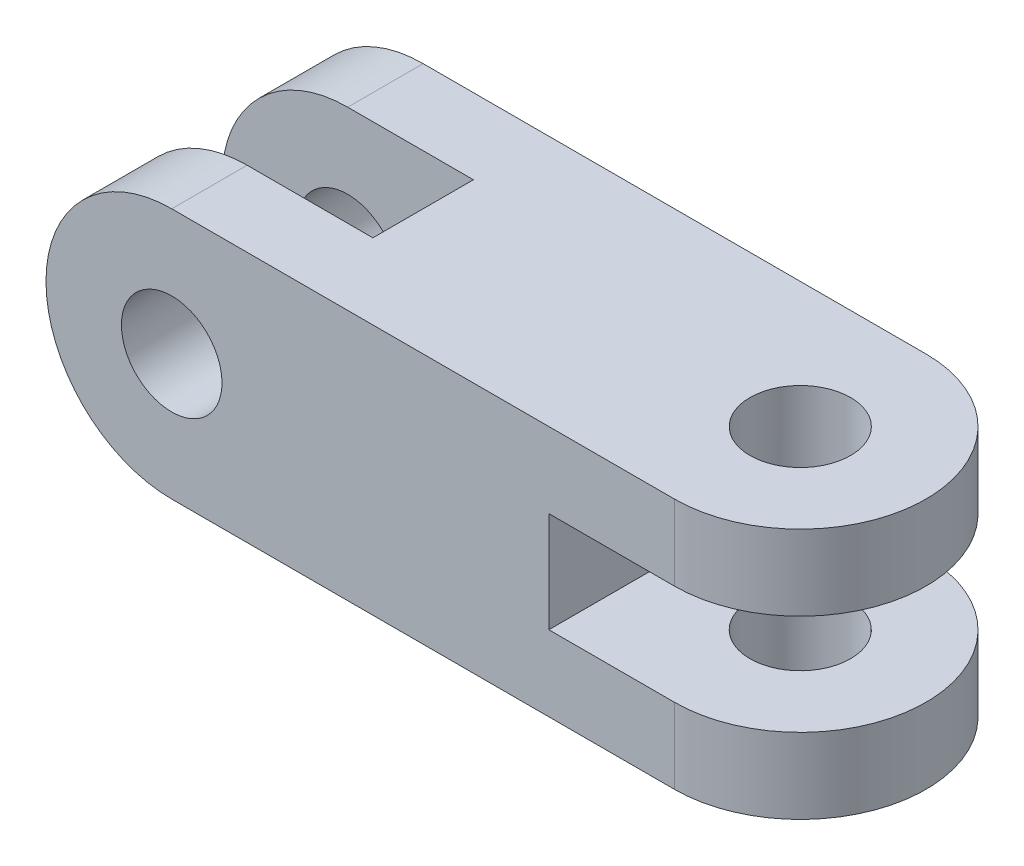
ISO-10303-21;
HEADER;
FILE_DESCRIPTION(('STEP AP214'),'2;1');
FILE_NAME('part.step','',(''),(''),'','','');
FILE_SCHEMA(('AUTOMOTIVE_DESIGN { 1 0 10303 214 1 1 1 1 }'));
ENDSEC;
DATA;
#1=APPLICATION_CONTEXT('core data for automotive mechanical design processes');
#2=APPLICATION_PROTOCOL_DEFINITION('international standard','automotive_design',2000,#1);
#3=PRODUCT_CONTEXT('',#1,'mechanical');
#4=PRODUCT('Part','Part','',(#3));
#5=PRODUCT_RELATED_PRODUCT_CATEGORY('part','',(#4));
#6=PRODUCT_DEFINITION_FORMATION('','',#4);
#7=PRODUCT_DEFINITION_CONTEXT('part definition',#1,'design');
#8=PRODUCT_DEFINITION('design','',#6,#7);
#9=PRODUCT_DEFINITION_SHAPE('','',#8);
#10=(LENGTH_UNIT() NAMED_UNIT(*) SI_UNIT(.MILLI.,.METRE.));
#11=(NAMED_UNIT(*) PLANE_ANGLE_UNIT() SI_UNIT($,.RADIAN.));
#12=(NAMED_UNIT(*) SI_UNIT($,.STERADIAN.) SOLID_ANGLE_UNIT());
#13=UNCERTAINTY_MEASURE_WITH_UNIT(LENGTH_MEASURE(1.E-05),#10,'distance_accuracy_value','');
#14=(GEOMETRIC_REPRESENTATION_CONTEXT(3) GLOBAL_UNCERTAINTY_ASSIGNED_CONTEXT((#13)) GLOBAL_UNIT_ASSIGNED_CONTEXT((#10,
#11,#12)) REPRESENTATION_CONTEXT('',''));
#15=CARTESIAN_POINT('',(0.,0.,0.));
#16=DIRECTION('',(0.,0.,1.));
#17=DIRECTION('',(1.,0.,0.));
#18=AXIS2_PLACEMENT_3D('',#15,#16,#17);
#19=CARTESIAN_POINT('',(-53.5,25.,5.18840413904367));
#20=DIRECTION('',(0.,0.,-1.));
#21=DIRECTION('',(-1.,0.,0.));
#22=AXIS2_PLACEMENT_3D('',#19,#20,#21);
#23=CYLINDRICAL_SURFACE('',#22,25.);
#24=DIRECTION('',(0.,0.,1.));
#25=VECTOR('',#24,1.);
#26=CARTESIAN_POINT('',(-53.5,50.,5.18840413904367));
#27=LINE('',#26,#25);
#28=CARTESIAN_POINT('',(-53.5,50.,-19.8115958609563));
#29=VERTEX_POINT('',#28);
#30=CARTESIAN_POINT('',(-53.5,50.,-4.81159586095631));
#31=VERTEX_POINT('',#30);
#32=EDGE_CURVE('E254',#29,#31,#27,.T.);
#33=ORIENTED_EDGE('',*,*,#32,.F.);
#34=CARTESIAN_POINT('',(-53.5,25.,-19.8115958609563));
#35=DIRECTION('',(0.,0.,1.));
#36=DIRECTION('',(1.,0.,0.));
#37=AXIS2_PLACEMENT_3D('',#34,#35,#36);
#38=CIRCLE('',#37,25.);
#39=CARTESIAN_POINT('',(-78.5,25.,-19.8115958609563));
#40=VERTEX_POINT('',#39);
#41=EDGE_CURVE('E42',#40,#29,#38,.F.);
#42=ORIENTED_EDGE('',*,*,#41,.F.);
#43=DIRECTION('',(0.,0.,1.));
#44=VECTOR('',#43,1.);
#45=CARTESIAN_POINT('',(-78.5,25.,-19.8115958609563));
#46=LINE('',#45,#44);
#47=CARTESIAN_POINT('',(-78.5,25.,-4.81159586095631));
#48=VERTEX_POINT('',#47);
#49=EDGE_CURVE('E222',#40,#48,#46,.T.);
#50=ORIENTED_EDGE('',*,*,#49,.T.);
#51=CARTESIAN_POINT('',(-53.5,25.,-4.81159586095631));
#52=DIRECTION('',(0.,0.,-1.));
#53=DIRECTION('',(-1.,0.,0.));
#54=AXIS2_PLACEMENT_3D('',#51,#52,#53);
#55=CIRCLE('',#54,25.);
#56=EDGE_CURVE('E11',#31,#48,#55,.F.);
#57=ORIENTED_EDGE('',*,*,#56,.F.);
#58=EDGE_LOOP('',(#33,#42,#50,#57));
#59=FACE_BOUND('',#58,.T.);
#60=ADVANCED_FACE('F35',(#59),#23,.T.);
#61=CARTESIAN_POINT('',(-53.5,25.,5.18840413904349));
#62=DIRECTION('',(0.,0.,-1.));
#63=DIRECTION('',(-1.,0.,0.));
#64=AXIS2_PLACEMENT_3D('',#61,#62,#63);
#65=CYLINDRICAL_SURFACE('',#64,25.);
#66=DIRECTION('',(0.,0.,1.));
#67=VECTOR('',#66,1.);
#68=CARTESIAN_POINT('',(-53.5,50.,5.18840413904349));
#69=LINE('',#68,#67);
#70=CARTESIAN_POINT('',(-53.5,50.,15.1884041390437));
#71=VERTEX_POINT('',#70);
#72=CARTESIAN_POINT('',(-53.5,50.,30.1884041390437));
#73=VERTEX_POINT('',#72);
#74=EDGE_CURVE('E247',#71,#73,#69,.T.);
#75=ORIENTED_EDGE('',*,*,#74,.F.);
#76=CARTESIAN_POINT('',(-53.5,25.,15.1884041390437));
#77=DIRECTION('',(0.,0.,1.));
#78=DIRECTION('',(1.,0.,0.));
#79=AXIS2_PLACEMENT_3D('',#76,#77,#78);
#80=CIRCLE('',#79,25.);
#81=CARTESIAN_POINT('',(-78.5,25.,15.1884041390437));
#82=VERTEX_POINT('',#81);
#83=EDGE_CURVE('E250',#82,#71,#80,.F.);
#84=ORIENTED_EDGE('',*,*,#83,.F.);
#85=DIRECTION('',(0.,0.,1.));
#86=VECTOR('',#85,1.);
#87=CARTESIAN_POINT('',(-78.5,25.,15.1884041390437));
#88=LINE('',#87,#86);
#89=CARTESIAN_POINT('',(-78.5,25.,30.1884041390437));
#90=VERTEX_POINT('',#89);
#91=EDGE_CURVE('E236',#82,#90,#88,.T.);
#92=ORIENTED_EDGE('',*,*,#91,.T.);
#93=CARTESIAN_POINT('',(-53.5,25.,30.1884041390437));
#94=DIRECTION('',(0.,0.,-1.));
#95=DIRECTION('',(-1.,0.,0.));
#96=AXIS2_PLACEMENT_3D('',#93,#94,#95);
#97=CIRCLE('',#96,25.);
#98=EDGE_CURVE('E252',#73,#90,#97,.F.);
#99=ORIENTED_EDGE('',*,*,#98,.F.);
#100=EDGE_LOOP('',(#75,#84,#92,#99));
#101=FACE_BOUND('',#100,.T.);
#102=ADVANCED_FACE('F277',(#101),#65,.T.);
#103=CARTESIAN_POINT('',(-53.5,25.,15.1884041390437));
#104=DIRECTION('',(0.,0.,1.));
#105=DIRECTION('',(1.,0.,0.));
#106=AXIS2_PLACEMENT_3D('',#103,#104,#105);
#107=CYLINDRICAL_SURFACE('',#106,25.);
#108=ORIENTED_EDGE('',*,*,#91,.F.);
#109=CARTESIAN_POINT('',(-53.5,25.,15.1884041390437));
#110=DIRECTION('',(0.,0.,1.));
#111=DIRECTION('',(1.,0.,0.));
#112=AXIS2_PLACEMENT_3D('',#109,#110,#111);
#113=CIRCLE('',#112,25.);
#114=CARTESIAN_POINT('',(-53.5,0.,15.1884041390437));
#115=VERTEX_POINT('',#114);
#116=EDGE_CURVE('E242',#115,#82,#113,.F.);
#117=ORIENTED_EDGE('',*,*,#116,.F.);
#118=DIRECTION('',(0.,0.,1.));
#119=VECTOR('',#118,1.);
#120=CARTESIAN_POINT('',(-53.5,0.,5.18840413904349));
#121=LINE('',#120,#119);
#122=CARTESIAN_POINT('',(-53.5,0.,30.1884041390437));
#123=VERTEX_POINT('',#122);
#124=EDGE_CURVE('E239',#123,#115,#121,.F.);
#125=ORIENTED_EDGE('',*,*,#124,.F.);
#126=CARTESIAN_POINT('',(-53.5,25.,30.1884041390437));
#127=DIRECTION('',(0.,0.,-1.));
#128=DIRECTION('',(-1.,0.,0.));
#129=AXIS2_PLACEMENT_3D('',#126,#127,#128);
#130=CIRCLE('',#129,25.);
#131=EDGE_CURVE('E245',#90,#123,#130,.F.);
#132=ORIENTED_EDGE('',*,*,#131,.F.);
#133=EDGE_LOOP('',(#108,#117,#125,#132));
#134=FACE_BOUND('',#133,.T.);
#135=ADVANCED_FACE('F284',(#134),#107,.T.);
#136=CARTESIAN_POINT('',(-53.5,25.,-19.8115958609563));
#137=DIRECTION('',(0.,0.,1.));
#138=DIRECTION('',(1.,0.,0.));
#139=AXIS2_PLACEMENT_3D('',#136,#137,#138);
#140=CYLINDRICAL_SURFACE('',#139,25.);
#141=ORIENTED_EDGE('',*,*,#49,.F.);
#142=CARTESIAN_POINT('',(-53.5,25.,-19.8115958609563));
#143=DIRECTION('',(0.,0.,1.));
#144=DIRECTION('',(1.,0.,0.));
#145=AXIS2_PLACEMENT_3D('',#142,#143,#144);
#146=CIRCLE('',#145,25.);
#147=CARTESIAN_POINT('',(-53.5,0.,-19.8115958609563));
#148=VERTEX_POINT('',#147);
#149=EDGE_CURVE('E234',#148,#40,#146,.F.);
#150=ORIENTED_EDGE('',*,*,#149,.F.);
#151=DIRECTION('',(0.,0.,1.));
#152=VECTOR('',#151,1.);
#153=CARTESIAN_POINT('',(-53.5,0.,5.18840413904367));
#154=LINE('',#153,#152);
#155=CARTESIAN_POINT('',(-53.5,0.,-4.81159586095631));
#156=VERTEX_POINT('',#155);
#157=EDGE_CURVE('E231',#156,#148,#154,.F.);
#158=ORIENTED_EDGE('',*,*,#157,.F.);
#159=CARTESIAN_POINT('',(-53.5,25.,-4.81159586095631));
#160=DIRECTION('',(0.,0.,-1.));
#161=DIRECTION('',(-1.,0.,0.));
#162=AXIS2_PLACEMENT_3D('',#159,#160,#161);
#163=CIRCLE('',#162,25.);
#164=EDGE_CURVE('E228',#48,#156,#163,.F.);
#165=ORIENTED_EDGE('',*,*,#164,.F.);
#166=EDGE_LOOP('',(#141,#150,#158,#165));
#167=FACE_BOUND('',#166,.T.);
#168=ADVANCED_FACE('F314',(#167),#140,.T.);
#169=CARTESIAN_POINT('',(46.5,50.,5.18840413904367));
#170=DIRECTION('',(0.,-1.,0.));
#171=DIRECTION('',(0.,0.,-1.));
#172=AXIS2_PLACEMENT_3D('',#169,#170,#171);
#173=CYLINDRICAL_SURFACE('',#172,25.);
#174=CARTESIAN_POINT('',(46.5,15.,5.18840413904367));
#175=DIRECTION('',(0.,-1.,0.));
#176=DIRECTION('',(1.,0.,0.));
#177=AXIS2_PLACEMENT_3D('',#174,#175,#176);
#178=CIRCLE('',#177,25.);
#179=CARTESIAN_POINT('',(46.5,15.,-19.8115958609563));
#180=VERTEX_POINT('',#179);
#181=CARTESIAN_POINT('',(46.5,15.,30.1884041390437));
#182=VERTEX_POINT('',#181);
#183=EDGE_CURVE('E172',#180,#182,#178,.T.);
#184=ORIENTED_EDGE('',*,*,#183,.T.);
#185=DIRECTION('',(0.,-1.,0.));
#186=VECTOR('',#185,1.);
#187=CARTESIAN_POINT('',(46.5,50.,30.1884041390437));
#188=LINE('',#187,#186);
#189=CARTESIAN_POINT('',(46.5,0.,30.1884041390437));
#190=VERTEX_POINT('',#189);
#191=EDGE_CURVE('E197',#182,#190,#188,.T.);
#192=ORIENTED_EDGE('',*,*,#191,.T.);
#193=CARTESIAN_POINT('',(46.5,0.,5.18840413904367));
#194=DIRECTION('',(0.,1.,0.));
#195=DIRECTION('',(0.,0.,1.));
#196=AXIS2_PLACEMENT_3D('',#193,#194,#195);
#197=CIRCLE('',#196,25.);
#198=CARTESIAN_POINT('',(46.5,0.,-19.8115958609563));
#199=VERTEX_POINT('',#198);
#200=EDGE_CURVE('E178',#190,#199,#197,.T.);
#201=ORIENTED_EDGE('',*,*,#200,.T.);
#202=DIRECTION('',(0.,-1.,0.));
#203=VECTOR('',#202,1.);
#204=CARTESIAN_POINT('',(46.5,50.,-19.8115958609563));
#205=LINE('',#204,#203);
#206=EDGE_CURVE('E220',#180,#199,#205,.T.);
#207=ORIENTED_EDGE('',*,*,#206,.F.);
#208=EDGE_LOOP('',(#184,#192,#201,#207));
#209=FACE_BOUND('',#208,.T.);
#210=ADVANCED_FACE('F295',(#209),#173,.T.);
#211=CARTESIAN_POINT('',(46.5,50.,5.18840413904367));
#212=DIRECTION('',(0.,-1.,0.));
#213=DIRECTION('',(0.,0.,-1.));
#214=AXIS2_PLACEMENT_3D('',#211,#212,#213);
#215=CYLINDRICAL_SURFACE('',#214,10.);
#216=CARTESIAN_POINT('',(46.5,15.,5.18840413904367));
#217=DIRECTION('',(0.,-1.,0.));
#218=DIRECTION('',(1.,0.,0.));
#219=AXIS2_PLACEMENT_3D('',#216,#217,#218);
#220=CIRCLE('',#219,10.);
#221=CARTESIAN_POINT('',(56.5,15.,5.18840413904367));
#222=VERTEX_POINT('',#221);
#223=EDGE_CURVE('E171',#222,#222,#220,.T.);
#224=ORIENTED_EDGE('',*,*,#223,.F.);
#225=EDGE_LOOP('',(#224));
#226=FACE_BOUND('',#225,.T.);
#227=CARTESIAN_POINT('',(46.5,0.,5.18840413904367));
#228=DIRECTION('',(0.,1.,0.));
#229=DIRECTION('',(0.,0.,1.));
#230=AXIS2_PLACEMENT_3D('',#227,#228,#229);
#231=CIRCLE('',#230,10.);
#232=CARTESIAN_POINT('',(46.5,0.,15.1884041390437));
#233=VERTEX_POINT('',#232);
#234=EDGE_CURVE('E174',#233,#233,#231,.T.);
#235=ORIENTED_EDGE('',*,*,#234,.F.);
#236=EDGE_LOOP('',(#235));
#237=FACE_BOUND('',#236,.T.);
#238=ADVANCED_FACE('F313',(#226,#237),#215,.F.);
#239=CARTESIAN_POINT('',(46.5,50.,5.18840413904367));
#240=DIRECTION('',(0.,1.,0.));
#241=DIRECTION('',(0.,0.,1.));
#242=AXIS2_PLACEMENT_3D('',#239,#240,#241);
#243=PLANE('',#242);
#244=DIRECTION('',(-1.,0.,0.));
#245=VECTOR('',#244,1.);
#246=CARTESIAN_POINT('',(46.5,50.,-19.8115958609563));
#247=LINE('',#246,#245);
#248=CARTESIAN_POINT('',(46.5,50.,-19.8115958609563));
#249=VERTEX_POINT('',#248);
#250=EDGE_CURVE('E184',#249,#29,#247,.T.);
#251=ORIENTED_EDGE('',*,*,#250,.T.);
#252=ORIENTED_EDGE('',*,*,#32,.T.);
#253=DIRECTION('',(1.,0.,0.));
#254=VECTOR('',#253,1.);
#255=CARTESIAN_POINT('',(-78.5,50.,-4.81159586095631));
#256=LINE('',#255,#254);
#257=CARTESIAN_POINT('',(-28.5,50.,-4.81159586095631));
#258=VERTEX_POINT('',#257);
#259=EDGE_CURVE('E188',#31,#258,#256,.T.);
#260=ORIENTED_EDGE('',*,*,#259,.T.);
#261=DIRECTION('',(0.,0.,1.));
#262=VECTOR('',#261,1.);
#263=CARTESIAN_POINT('',(-28.5,50.,-4.81159586095631));
#264=LINE('',#263,#262);
#265=CARTESIAN_POINT('',(-28.5,50.,15.1884041390437));
#266=VERTEX_POINT('',#265);
#267=EDGE_CURVE('E190',#258,#266,#264,.T.);
#268=ORIENTED_EDGE('',*,*,#267,.T.);
#269=DIRECTION('',(-1.,0.,0.));
#270=VECTOR('',#269,1.);
#271=CARTESIAN_POINT('',(-78.5,50.,15.1884041390437));
#272=LINE('',#271,#270);
#273=EDGE_CURVE('E192',#266,#71,#272,.T.);
#274=ORIENTED_EDGE('',*,*,#273,.T.);
#275=ORIENTED_EDGE('',*,*,#74,.T.);
#276=DIRECTION('',(1.,0.,0.));
#277=VECTOR('',#276,1.);
#278=CARTESIAN_POINT('',(46.5,50.,30.1884041390437));
#279=LINE('',#278,#277);
#280=CARTESIAN_POINT('',(46.5,50.,30.1884041390437));
#281=VERTEX_POINT('',#280);
#282=EDGE_CURVE('E195',#73,#281,#279,.T.);
#283=ORIENTED_EDGE('',*,*,#282,.T.);
#284=CARTESIAN_POINT('',(46.5,50.,5.18840413904367));
#285=DIRECTION('',(0.,1.,0.));
#286=DIRECTION('',(0.,0.,1.));
#287=AXIS2_PLACEMENT_3D('',#284,#285,#286);
#288=CIRCLE('',#287,25.);
#289=EDGE_CURVE('E181',#281,#249,#288,.T.);
#290=ORIENTED_EDGE('',*,*,#289,.T.);
#291=EDGE_LOOP('',(#251,#252,#260,#268,#274,#275,#283,#290));
#292=FACE_BOUND('',#291,.T.);
#293=CARTESIAN_POINT('',(46.5,50.,5.18840413904367));
#294=DIRECTION('',(0.,1.,0.));
#295=DIRECTION('',(0.,0.,1.));
#296=AXIS2_PLACEMENT_3D('',#293,#294,#295);
#297=CIRCLE('',#296,10.);
#298=CARTESIAN_POINT('',(46.5,50.,15.1884041390437));
#299=VERTEX_POINT('',#298);
#300=EDGE_CURVE('E175',#299,#299,#297,.T.);
#301=ORIENTED_EDGE('',*,*,#300,.F.);
#302=EDGE_LOOP('',(#301));
#303=FACE_BOUND('',#302,.T.);
#304=ADVANCED_FACE('F257',(#292,#303),#243,.T.);
#305=CARTESIAN_POINT('',(46.5,0.,5.18840413904367));
#306=DIRECTION('',(0.,1.,0.));
#307=DIRECTION('',(0.,0.,1.));
#308=AXIS2_PLACEMENT_3D('',#305,#306,#307);
#309=PLANE('',#308);
#310=DIRECTION('',(1.,0.,0.));
#311=VECTOR('',#310,1.);
#312=CARTESIAN_POINT('',(46.5,0.,30.1884041390437));
#313=LINE('',#312,#311);
#314=EDGE_CURVE('E185',#123,#190,#313,.T.);
#315=ORIENTED_EDGE('',*,*,#314,.F.);
#316=ORIENTED_EDGE('',*,*,#124,.T.);
#317=DIRECTION('',(-1.,0.,0.));
#318=VECTOR('',#317,1.);
#319=CARTESIAN_POINT('',(-78.5,0.,15.1884041390437));
#320=LINE('',#319,#318);
#321=CARTESIAN_POINT('',(-28.5,0.,15.1884041390437));
#322=VERTEX_POINT('',#321);
#323=EDGE_CURVE('E207',#322,#115,#320,.T.);
#324=ORIENTED_EDGE('',*,*,#323,.F.);
#325=DIRECTION('',(0.,0.,1.));
#326=VECTOR('',#325,1.);
#327=CARTESIAN_POINT('',(-28.5,0.,-4.81159586095631));
#328=LINE('',#327,#326);
#329=CARTESIAN_POINT('',(-28.5,0.,-4.81159586095631));
#330=VERTEX_POINT('',#329);
#331=EDGE_CURVE('E205',#330,#322,#328,.T.);
#332=ORIENTED_EDGE('',*,*,#331,.F.);
#333=DIRECTION('',(1.,0.,0.));
#334=VECTOR('',#333,1.);
#335=CARTESIAN_POINT('',(-78.5,0.,-4.81159586095631));
#336=LINE('',#335,#334);
#337=EDGE_CURVE('E203',#156,#330,#336,.T.);
#338=ORIENTED_EDGE('',*,*,#337,.F.);
#339=ORIENTED_EDGE('',*,*,#157,.T.);
#340=DIRECTION('',(-1.,0.,0.));
#341=VECTOR('',#340,1.);
#342=CARTESIAN_POINT('',(46.5,0.,-19.8115958609563));
#343=LINE('',#342,#341);
#344=EDGE_CURVE('E200',#199,#148,#343,.T.);
#345=ORIENTED_EDGE('',*,*,#344,.F.);
#346=ORIENTED_EDGE('',*,*,#200,.F.);
#347=EDGE_LOOP('',(#315,#316,#324,#332,#338,#339,#345,#346));
#348=FACE_BOUND('',#347,.T.);
#349=ORIENTED_EDGE('',*,*,#234,.T.);
#350=EDGE_LOOP('',(#349));
#351=FACE_BOUND('',#350,.T.);
#352=ADVANCED_FACE('F288',(#348,#351),#309,.F.);
#353=CARTESIAN_POINT('',(46.5,35.,30.1884041390437));
#354=VERTEX_POINT('',#353);
#355=EDGE_CURVE('E211',#281,#354,#188,.T.);
#356=ORIENTED_EDGE('',*,*,#355,.T.);
#357=CARTESIAN_POINT('',(46.5,35.,5.18840413904367));
#358=DIRECTION('',(0.,1.,0.));
#359=DIRECTION('',(-1.,0.,0.));
#360=AXIS2_PLACEMENT_3D('',#357,#358,#359);
#361=CIRCLE('',#360,25.);
#362=CARTESIAN_POINT('',(46.5,35.,-19.8115958609563));
#363=VERTEX_POINT('',#362);
#364=EDGE_CURVE('E169',#354,#363,#361,.T.);
#365=ORIENTED_EDGE('',*,*,#364,.T.);
#366=EDGE_CURVE('E154',#249,#363,#205,.T.);
#367=ORIENTED_EDGE('',*,*,#366,.F.);
#368=ORIENTED_EDGE('',*,*,#289,.F.);
#369=EDGE_LOOP('',(#356,#365,#367,#368));
#370=FACE_BOUND('',#369,.T.);
#371=ADVANCED_FACE('F301',(#370),#173,.T.);
#372=CARTESIAN_POINT('',(46.5,50.,-19.8115958609563));
#373=DIRECTION('',(0.,0.,1.));
#374=DIRECTION('',(1.,0.,0.));
#375=AXIS2_PLACEMENT_3D('',#372,#373,#374);
#376=PLANE('',#375);
#377=CARTESIAN_POINT('',(-53.5,25.,-19.8115958609563));
#378=DIRECTION('',(0.,0.,-1.));
#379=DIRECTION('',(-1.,0.,0.));
#380=AXIS2_PLACEMENT_3D('',#377,#378,#379);
#381=CIRCLE('',#380,9.99999999999999);
#382=CARTESIAN_POINT('',(-63.5,25.,-19.8115958609563));
#383=VERTEX_POINT('',#382);
#384=EDGE_CURVE('E480',#383,#383,#381,.T.);
#385=ORIENTED_EDGE('',*,*,#384,.F.);
#386=EDGE_LOOP('',(#385));
#387=FACE_BOUND('',#386,.T.);
#388=ORIENTED_EDGE('',*,*,#149,.T.);
#389=ORIENTED_EDGE('',*,*,#41,.T.);
#390=ORIENTED_EDGE('',*,*,#250,.F.);
#391=ORIENTED_EDGE('',*,*,#366,.T.);
#392=DIRECTION('',(-1.,0.,0.));
#393=VECTOR('',#392,1.);
#394=CARTESIAN_POINT('',(71.5,35.,-19.8115958609563));
#395=LINE('',#394,#393);
#396=CARTESIAN_POINT('',(21.5,35.,-19.8115958609563));
#397=VERTEX_POINT('',#396);
#398=EDGE_CURVE('E136',#363,#397,#395,.T.);
#399=ORIENTED_EDGE('',*,*,#398,.T.);
#400=DIRECTION('',(0.,-1.,0.));
#401=VECTOR('',#400,1.);
#402=CARTESIAN_POINT('',(21.5,35.,-19.8115958609563));
#403=LINE('',#402,#401);
#404=CARTESIAN_POINT('',(21.5,15.,-19.8115958609563));
#405=VERTEX_POINT('',#404);
#406=EDGE_CURVE('E147',#397,#405,#403,.T.);
#407=ORIENTED_EDGE('',*,*,#406,.T.);
#408=DIRECTION('',(1.,0.,0.));
#409=VECTOR('',#408,1.);
#410=CARTESIAN_POINT('',(71.5,15.,-19.8115958609563));
#411=LINE('',#410,#409);
#412=EDGE_CURVE('E144',#405,#180,#411,.T.);
#413=ORIENTED_EDGE('',*,*,#412,.T.);
#414=ORIENTED_EDGE('',*,*,#206,.T.);
#415=ORIENTED_EDGE('',*,*,#344,.T.);
#416=EDGE_LOOP('',(#388,#389,#390,#391,#399,#407,#413,#414,#415));
#417=FACE_BOUND('',#416,.T.);
#418=ADVANCED_FACE('F152',(#387,#417),#376,.F.);
#419=CARTESIAN_POINT('',(-78.5,50.,-4.81159586095631));
#420=DIRECTION('',(0.,0.,-1.));
#421=DIRECTION('',(-1.,0.,0.));
#422=AXIS2_PLACEMENT_3D('',#419,#420,#421);
#423=PLANE('',#422);
#424=CARTESIAN_POINT('',(-53.5,25.,-4.81159586095632));
#425=DIRECTION('',(0.,0.,-1.));
#426=DIRECTION('',(-1.,0.,0.));
#427=AXIS2_PLACEMENT_3D('',#424,#425,#426);
#428=CIRCLE('',#427,9.99999999999999);
#429=CARTESIAN_POINT('',(-63.5,25.,-4.81159586095632));
#430=VERTEX_POINT('',#429);
#431=EDGE_CURVE('E161',#430,#430,#428,.T.);
#432=ORIENTED_EDGE('',*,*,#431,.T.);
#433=EDGE_LOOP('',(#432));
#434=FACE_BOUND('',#433,.T.);
#435=ORIENTED_EDGE('',*,*,#259,.F.);
#436=ORIENTED_EDGE('',*,*,#56,.T.);
#437=ORIENTED_EDGE('',*,*,#164,.T.);
#438=ORIENTED_EDGE('',*,*,#337,.T.);
#439=DIRECTION('',(0.,-1.,0.));
#440=VECTOR('',#439,1.);
#441=CARTESIAN_POINT('',(-28.5,50.,-4.81159586095631));
#442=LINE('',#441,#440);
#443=EDGE_CURVE('E217',#258,#330,#442,.T.);
#444=ORIENTED_EDGE('',*,*,#443,.F.);
#445=EDGE_LOOP('',(#435,#436,#437,#438,#444));
#446=FACE_BOUND('',#445,.T.);
#447=ADVANCED_FACE('F261',(#434,#446),#423,.F.);
#448=CARTESIAN_POINT('',(-28.5,50.,-4.81159586095631));
#449=DIRECTION('',(1.,0.,0.));
#450=DIRECTION('',(0.,0.,-1.));
#451=AXIS2_PLACEMENT_3D('',#448,#449,#450);
#452=PLANE('',#451);
#453=ORIENTED_EDGE('',*,*,#331,.T.);
#454=DIRECTION('',(0.,-1.,0.));
#455=VECTOR('',#454,1.);
#456=CARTESIAN_POINT('',(-28.5,50.,15.1884041390437));
#457=LINE('',#456,#455);
#458=EDGE_CURVE('E214',#266,#322,#457,.T.);
#459=ORIENTED_EDGE('',*,*,#458,.F.);
#460=ORIENTED_EDGE('',*,*,#267,.F.);
#461=ORIENTED_EDGE('',*,*,#443,.T.);
#462=EDGE_LOOP('',(#453,#459,#460,#461));
#463=FACE_BOUND('',#462,.T.);
#464=ADVANCED_FACE('F268',(#463),#452,.F.);
#465=CARTESIAN_POINT('',(-78.5,50.,15.1884041390437));
#466=DIRECTION('',(0.,0.,1.));
#467=DIRECTION('',(1.,0.,0.));
#468=AXIS2_PLACEMENT_3D('',#465,#466,#467);
#469=PLANE('',#468);
#470=CARTESIAN_POINT('',(-53.5,25.,15.1884041390437));
#471=DIRECTION('',(0.,0.,1.));
#472=DIRECTION('',(1.,0.,0.));
#473=AXIS2_PLACEMENT_3D('',#470,#471,#472);
#474=CIRCLE('',#473,9.99999999999999);
#475=CARTESIAN_POINT('',(-43.5,25.,15.1884041390437));
#476=VERTEX_POINT('',#475);
#477=EDGE_CURVE('E475',#476,#476,#474,.T.);
#478=ORIENTED_EDGE('',*,*,#477,.T.);
#479=EDGE_LOOP('',(#478));
#480=FACE_BOUND('',#479,.T.);
#481=ORIENTED_EDGE('',*,*,#116,.T.);
#482=ORIENTED_EDGE('',*,*,#83,.T.);
#483=ORIENTED_EDGE('',*,*,#273,.F.);
#484=ORIENTED_EDGE('',*,*,#458,.T.);
#485=ORIENTED_EDGE('',*,*,#323,.T.);
#486=EDGE_LOOP('',(#481,#482,#483,#484,#485));
#487=FACE_BOUND('',#486,.T.);
#488=ADVANCED_FACE('F273',(#480,#487),#469,.F.);
#489=CARTESIAN_POINT('',(46.5,50.,30.1884041390437));
#490=DIRECTION('',(0.,0.,-1.));
#491=DIRECTION('',(-1.,0.,0.));
#492=AXIS2_PLACEMENT_3D('',#489,#490,#491);
#493=PLANE('',#492);
#494=CARTESIAN_POINT('',(-53.5,25.,30.1884041390437));
#495=DIRECTION('',(0.,0.,-1.));
#496=DIRECTION('',(-1.,0.,0.));
#497=AXIS2_PLACEMENT_3D('',#494,#495,#496);
#498=CIRCLE('',#497,9.99999999999999);
#499=CARTESIAN_POINT('',(-63.5,25.,30.1884041390437));
#500=VERTEX_POINT('',#499);
#501=EDGE_CURVE('E477',#500,#500,#498,.T.);
#502=ORIENTED_EDGE('',*,*,#501,.T.);
#503=EDGE_LOOP('',(#502));
#504=FACE_BOUND('',#503,.T.);
#505=ORIENTED_EDGE('',*,*,#282,.F.);
#506=ORIENTED_EDGE('',*,*,#98,.T.);
#507=ORIENTED_EDGE('',*,*,#131,.T.);
#508=ORIENTED_EDGE('',*,*,#314,.T.);
#509=ORIENTED_EDGE('',*,*,#191,.F.);
#510=DIRECTION('',(1.,0.,0.));
#511=VECTOR('',#510,1.);
#512=CARTESIAN_POINT('',(71.5,15.,30.1884041390437));
#513=LINE('',#512,#511);
#514=CARTESIAN_POINT('',(21.5,15.,30.1884041390437));
#515=VERTEX_POINT('',#514);
#516=EDGE_CURVE('E155',#515,#182,#513,.T.);
#517=ORIENTED_EDGE('',*,*,#516,.F.);
#518=DIRECTION('',(0.,-1.,0.));
#519=VECTOR('',#518,1.);
#520=CARTESIAN_POINT('',(21.5,35.,30.1884041390437));
#521=LINE('',#520,#519);
#522=CARTESIAN_POINT('',(21.5,35.,30.1884041390437));
#523=VERTEX_POINT('',#522);
#524=EDGE_CURVE('E158',#523,#515,#521,.T.);
#525=ORIENTED_EDGE('',*,*,#524,.F.);
#526=DIRECTION('',(-1.,0.,0.));
#527=VECTOR('',#526,1.);
#528=CARTESIAN_POINT('',(71.5,35.,30.1884041390437));
#529=LINE('',#528,#527);
#530=EDGE_CURVE('E139',#354,#523,#529,.T.);
#531=ORIENTED_EDGE('',*,*,#530,.F.);
#532=ORIENTED_EDGE('',*,*,#355,.F.);
#533=EDGE_LOOP('',(#505,#506,#507,#508,#509,#517,#525,#531,#532));
#534=FACE_BOUND('',#533,.T.);
#535=ADVANCED_FACE('F280',(#504,#534),#493,.F.);
#536=CARTESIAN_POINT('',(46.5,35.,5.18840413904367));
#537=DIRECTION('',(0.,1.,0.));
#538=DIRECTION('',(-1.,0.,0.));
#539=AXIS2_PLACEMENT_3D('',#536,#537,#538);
#540=CIRCLE('',#539,10.);
#541=CARTESIAN_POINT('',(36.5,35.,5.18840413904367));
#542=VERTEX_POINT('',#541);
#543=EDGE_CURVE('E167',#542,#542,#540,.T.);
#544=ORIENTED_EDGE('',*,*,#543,.F.);
#545=EDGE_LOOP('',(#544));
#546=FACE_BOUND('',#545,.T.);
#547=ORIENTED_EDGE('',*,*,#300,.T.);
#548=EDGE_LOOP('',(#547));
#549=FACE_BOUND('',#548,.T.);
#550=ADVANCED_FACE('F344',(#546,#549),#215,.F.);
#551=CARTESIAN_POINT('',(71.5,15.,-19.8115958609563));
#552=DIRECTION('',(0.,-1.,0.));
#553=DIRECTION('',(1.,0.,0.));
#554=AXIS2_PLACEMENT_3D('',#551,#552,#553);
#555=PLANE('',#554);
#556=ORIENTED_EDGE('',*,*,#223,.T.);
#557=EDGE_LOOP('',(#556));
#558=FACE_BOUND('',#557,.T.);
#559=ORIENTED_EDGE('',*,*,#183,.F.);
#560=ORIENTED_EDGE('',*,*,#412,.F.);
#561=DIRECTION('',(0.,0.,1.));
#562=VECTOR('',#561,1.);
#563=CARTESIAN_POINT('',(21.5,15.,-19.8115958609563));
#564=LINE('',#563,#562);
#565=EDGE_CURVE('E143',#405,#515,#564,.T.);
#566=ORIENTED_EDGE('',*,*,#565,.T.);
#567=ORIENTED_EDGE('',*,*,#516,.T.);
#568=EDGE_LOOP('',(#559,#560,#566,#567));
#569=FACE_BOUND('',#568,.T.);
#570=ADVANCED_FACE('F298',(#558,#569),#555,.F.);
#571=CARTESIAN_POINT('',(71.5,35.,-19.8115958609563));
#572=DIRECTION('',(0.,1.,0.));
#573=DIRECTION('',(-1.,0.,0.));
#574=AXIS2_PLACEMENT_3D('',#571,#572,#573);
#575=PLANE('',#574);
#576=ORIENTED_EDGE('',*,*,#543,.T.);
#577=EDGE_LOOP('',(#576));
#578=FACE_BOUND('',#577,.T.);
#579=ORIENTED_EDGE('',*,*,#530,.T.);
#580=DIRECTION('',(0.,0.,1.));
#581=VECTOR('',#580,1.);
#582=CARTESIAN_POINT('',(21.5,35.,-19.8115958609563));
#583=LINE('',#582,#581);
#584=EDGE_CURVE('E132',#397,#523,#583,.T.);
#585=ORIENTED_EDGE('',*,*,#584,.F.);
#586=ORIENTED_EDGE('',*,*,#398,.F.);
#587=ORIENTED_EDGE('',*,*,#364,.F.);
#588=EDGE_LOOP('',(#579,#585,#586,#587));
#589=FACE_BOUND('',#588,.T.);
#590=ADVANCED_FACE('F134',(#578,#589),#575,.F.);
#591=CARTESIAN_POINT('',(21.5,35.,-19.8115958609563));
#592=DIRECTION('',(-1.,0.,0.));
#593=DIRECTION('',(0.,0.,1.));
#594=AXIS2_PLACEMENT_3D('',#591,#592,#593);
#595=PLANE('',#594);
#596=ORIENTED_EDGE('',*,*,#524,.T.);
#597=ORIENTED_EDGE('',*,*,#565,.F.);
#598=ORIENTED_EDGE('',*,*,#406,.F.);
#599=ORIENTED_EDGE('',*,*,#584,.T.);
#600=EDGE_LOOP('',(#596,#597,#598,#599));
#601=FACE_BOUND('',#600,.T.);
#602=ADVANCED_FACE('F148',(#601),#595,.F.);
#603=CARTESIAN_POINT('',(-53.5,25.,30.1884041390437));
#604=DIRECTION('',(0.,0.,-1.));
#605=DIRECTION('',(-1.,0.,0.));
#606=AXIS2_PLACEMENT_3D('',#603,#604,#605);
#607=CYLINDRICAL_SURFACE('',#606,9.99999999999999);
#608=ORIENTED_EDGE('',*,*,#501,.F.);
#609=EDGE_LOOP('',(#608));
#610=FACE_BOUND('',#609,.T.);
#611=ORIENTED_EDGE('',*,*,#477,.F.);
#612=EDGE_LOOP('',(#611));
#613=FACE_BOUND('',#612,.T.);
#614=ADVANCED_FACE('F371',(#610,#613),#607,.F.);
#615=ORIENTED_EDGE('',*,*,#384,.T.);
#616=EDGE_LOOP('',(#615));
#617=FACE_BOUND('',#616,.T.);
#618=ORIENTED_EDGE('',*,*,#431,.F.);
#619=EDGE_LOOP('',(#618));
#620=FACE_BOUND('',#619,.T.);
#621=ADVANCED_FACE('F377',(#617,#620),#607,.F.);
#622=CLOSED_SHELL('',(#60,#102,#135,#168,#210,#238,#304,#352,#371,#418,#447,#464,#488,#535,#550,
#570,#590,#602,#614,#621));
#623=MANIFOLD_SOLID_BREP('B2',#622);
#624=ADVANCED_BREP_SHAPE_REPRESENTATION('',(#18,#623),#14);
#625=SHAPE_DEFINITION_REPRESENTATION(#9,#624);
ENDSEC;
END-ISO-10303-21;
